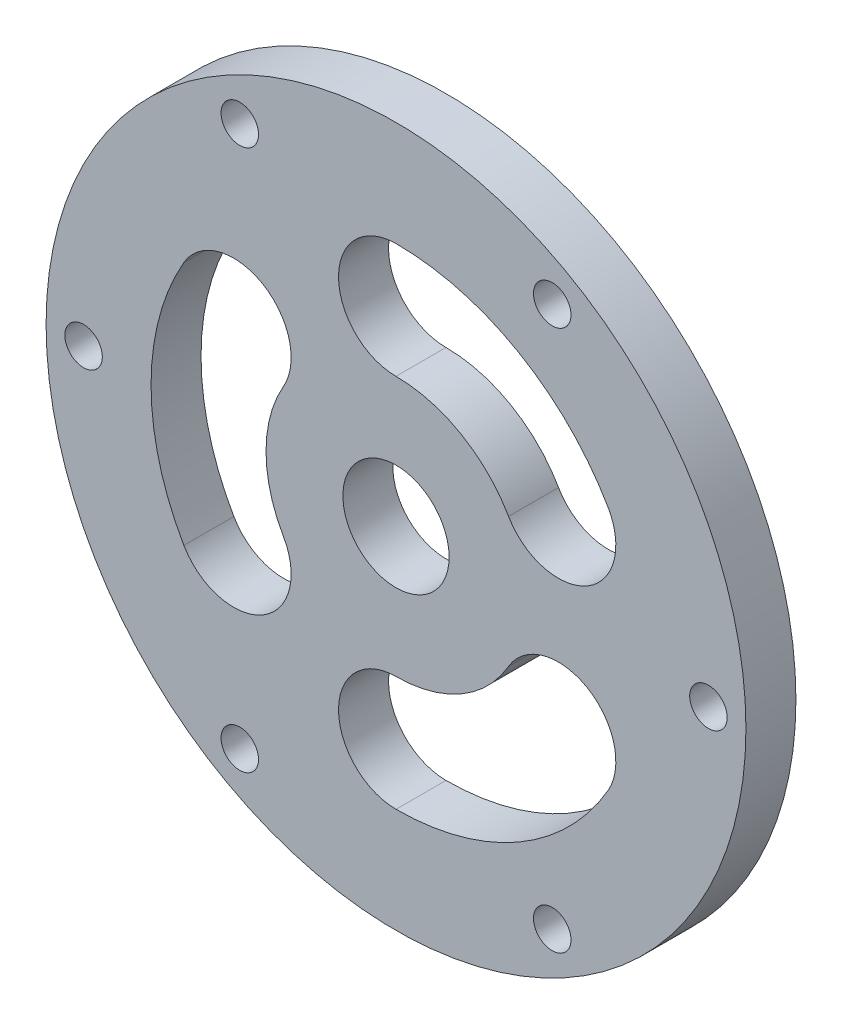
ISO-10303-21;
HEADER;
FILE_DESCRIPTION(('STEP AP214'),'2;1');
FILE_NAME('part.step','',(''),(''),'','','');
FILE_SCHEMA(('AUTOMOTIVE_DESIGN { 1 0 10303 214 1 1 1 1 }'));
ENDSEC;
DATA;
#1=APPLICATION_CONTEXT('core data for automotive mechanical design processes');
#2=APPLICATION_PROTOCOL_DEFINITION('international standard','automotive_design',2000,#1);
#3=PRODUCT_CONTEXT('',#1,'mechanical');
#4=PRODUCT('Part','Part','',(#3));
#5=PRODUCT_RELATED_PRODUCT_CATEGORY('part','',(#4));
#6=PRODUCT_DEFINITION_FORMATION('','',#4);
#7=PRODUCT_DEFINITION_CONTEXT('part definition',#1,'design');
#8=PRODUCT_DEFINITION('design','',#6,#7);
#9=PRODUCT_DEFINITION_SHAPE('','',#8);
#10=(LENGTH_UNIT() NAMED_UNIT(*) SI_UNIT(.MILLI.,.METRE.));
#11=(NAMED_UNIT(*) PLANE_ANGLE_UNIT() SI_UNIT($,.RADIAN.));
#12=(NAMED_UNIT(*) SI_UNIT($,.STERADIAN.) SOLID_ANGLE_UNIT());
#13=UNCERTAINTY_MEASURE_WITH_UNIT(LENGTH_MEASURE(1.E-05),#10,'distance_accuracy_value','');
#14=(GEOMETRIC_REPRESENTATION_CONTEXT(3) GLOBAL_UNCERTAINTY_ASSIGNED_CONTEXT((#13)) GLOBAL_UNIT_ASSIGNED_CONTEXT((#10,
#11,#12)) REPRESENTATION_CONTEXT('',''));
#15=CARTESIAN_POINT('',(0.,0.,0.));
#16=DIRECTION('',(0.,0.,1.));
#17=DIRECTION('',(1.,0.,0.));
#18=AXIS2_PLACEMENT_3D('',#15,#16,#17);
#19=CARTESIAN_POINT('',(0.,0.,4.));
#20=DIRECTION('',(0.,0.,1.));
#21=DIRECTION('',(1.,0.,0.));
#22=AXIS2_PLACEMENT_3D('',#19,#20,#21);
#23=PLANE('',#22);
#24=CARTESIAN_POINT('',(-24.9999999999986,-2.4721941194024E-12,4.));
#25=DIRECTION('',(0.,0.,1.));
#26=DIRECTION('',(1.,0.,0.));
#27=AXIS2_PLACEMENT_3D('',#24,#25,#26);
#28=CIRCLE('',#27,1.5000000000031);
#29=CARTESIAN_POINT('',(-23.4999999999955,-2.4721941194024E-12,4.));
#30=VERTEX_POINT('',#29);
#31=EDGE_CURVE('E270',#30,#30,#28,.T.);
#32=ORIENTED_EDGE('',*,*,#31,.F.);
#33=EDGE_LOOP('',(#32));
#34=FACE_BOUND('',#33,.T.);
#35=CARTESIAN_POINT('',(12.5000000000029,-21.650635094611,4.));
#36=DIRECTION('',(0.,0.,1.));
#37=DIRECTION('',(1.,0.,0.));
#38=AXIS2_PLACEMENT_3D('',#35,#36,#37);
#39=CIRCLE('',#38,1.5000000000031);
#40=CARTESIAN_POINT('',(14.000000000006,-21.650635094611,4.));
#41=VERTEX_POINT('',#40);
#42=EDGE_CURVE('E278',#41,#41,#39,.T.);
#43=ORIENTED_EDGE('',*,*,#42,.F.);
#44=EDGE_LOOP('',(#43));
#45=FACE_BOUND('',#44,.T.);
#46=CARTESIAN_POINT('',(0.,0.,4.));
#47=DIRECTION('',(0.,0.,-1.));
#48=DIRECTION('',(1.,0.,0.));
#49=AXIS2_PLACEMENT_3D('',#46,#47,#48);
#50=CIRCLE('',#49,10.4);
#51=CARTESIAN_POINT('',(2.43109524913691E-13,10.4,4.));
#52=VERTEX_POINT('',#51);
#53=CARTESIAN_POINT('',(9.00666419935822,5.19999999999989,4.));
#54=VERTEX_POINT('',#53);
#55=EDGE_CURVE('E130',#52,#54,#50,.T.);
#56=ORIENTED_EDGE('',*,*,#55,.F.);
#57=CARTESIAN_POINT('',(3.1485231088979E-13,15.,4.));
#58=DIRECTION('',(0.,0.,1.));
#59=DIRECTION('',(-1.,0.,0.));
#60=AXIS2_PLACEMENT_3D('',#57,#58,#59);
#61=CIRCLE('',#60,4.6);
#62=CARTESIAN_POINT('',(4.6252002505541E-13,19.6,4.));
#63=VERTEX_POINT('',#62);
#64=EDGE_CURVE('E122',#63,#52,#61,.T.);
#65=ORIENTED_EDGE('',*,*,#64,.F.);
#66=CARTESIAN_POINT('',(0.,0.,4.));
#67=DIRECTION('',(0.,0.,1.));
#68=DIRECTION('',(1.,0.,0.));
#69=AXIS2_PLACEMENT_3D('',#66,#67,#68);
#70=CIRCLE('',#69,19.6);
#71=CARTESIAN_POINT('',(16.9740979141751,9.79999999999979,4.));
#72=VERTEX_POINT('',#71);
#73=EDGE_CURVE('E145',#72,#63,#70,.T.);
#74=ORIENTED_EDGE('',*,*,#73,.F.);
#75=CARTESIAN_POINT('',(12.9903810567666,7.49999999999988,4.));
#76=DIRECTION('',(0.,0.,1.));
#77=DIRECTION('',(1.,0.,0.));
#78=AXIS2_PLACEMENT_3D('',#75,#76,#77);
#79=CIRCLE('',#78,4.6);
#80=EDGE_CURVE('E143',#54,#72,#79,.T.);
#81=ORIENTED_EDGE('',*,*,#80,.F.);
#82=EDGE_LOOP('',(#56,#65,#74,#81));
#83=FACE_BOUND('',#82,.T.);
#84=CARTESIAN_POINT('',(12.5,21.650635094611,4.));
#85=DIRECTION('',(0.,0.,1.));
#86=DIRECTION('',(1.,0.,0.));
#87=AXIS2_PLACEMENT_3D('',#84,#85,#86);
#88=CIRCLE('',#87,1.5000000000031);
#89=CARTESIAN_POINT('',(14.0000000000031,21.650635094611,4.));
#90=VERTEX_POINT('',#89);
#91=EDGE_CURVE('E161',#90,#90,#88,.T.);
#92=ORIENTED_EDGE('',*,*,#91,.F.);
#93=EDGE_LOOP('',(#92));
#94=FACE_BOUND('',#93,.T.);
#95=CARTESIAN_POINT('',(0.,0.,4.));
#96=DIRECTION('',(0.,0.,-1.));
#97=DIRECTION('',(1.,0.,0.));
#98=AXIS2_PLACEMENT_3D('',#95,#96,#97);
#99=CIRCLE('',#98,10.4);
#100=CARTESIAN_POINT('',(-9.00666419935829,-5.19999999999978,4.));
#101=VERTEX_POINT('',#100);
#102=CARTESIAN_POINT('',(-9.0066641993581,5.20000000000011,4.));
#103=VERTEX_POINT('',#102);
#104=EDGE_CURVE('E175',#101,#103,#99,.T.);
#105=ORIENTED_EDGE('',*,*,#104,.F.);
#106=CARTESIAN_POINT('',(-12.9903810567666,-7.4999999999999,4.));
#107=DIRECTION('',(0.,0.,1.));
#108=DIRECTION('',(-1.,0.,0.));
#109=AXIS2_PLACEMENT_3D('',#106,#107,#108);
#110=CIRCLE('',#109,4.6);
#111=CARTESIAN_POINT('',(-16.9740979141752,-9.7999999999996,4.));
#112=VERTEX_POINT('',#111);
#113=EDGE_CURVE('E173',#112,#101,#110,.T.);
#114=ORIENTED_EDGE('',*,*,#113,.F.);
#115=CARTESIAN_POINT('',(0.,0.,4.));
#116=DIRECTION('',(0.,0.,1.));
#117=DIRECTION('',(1.,0.,0.));
#118=AXIS2_PLACEMENT_3D('',#115,#116,#117);
#119=CIRCLE('',#118,19.6);
#120=CARTESIAN_POINT('',(-16.9740979141749,9.80000000000022,4.));
#121=VERTEX_POINT('',#120);
#122=EDGE_CURVE('E181',#121,#112,#119,.T.);
#123=ORIENTED_EDGE('',*,*,#122,.F.);
#124=CARTESIAN_POINT('',(-12.9903810567666,7.5,4.));
#125=DIRECTION('',(0.,0.,1.));
#126=DIRECTION('',(1.,0.,0.));
#127=AXIS2_PLACEMENT_3D('',#124,#125,#126);
#128=CIRCLE('',#127,4.6);
#129=EDGE_CURVE('E178',#103,#121,#128,.T.);
#130=ORIENTED_EDGE('',*,*,#129,.F.);
#131=EDGE_LOOP('',(#105,#114,#123,#130));
#132=FACE_BOUND('',#131,.T.);
#133=CARTESIAN_POINT('',(12.9903810567665,-7.50000000000015,4.));
#134=DIRECTION('',(0.,0.,1.));
#135=DIRECTION('',(-1.,0.,0.));
#136=AXIS2_PLACEMENT_3D('',#133,#134,#135);
#137=CIRCLE('',#136,4.6);
#138=CARTESIAN_POINT('',(16.9740979141748,-9.8000000000004,4.));
#139=VERTEX_POINT('',#138);
#140=CARTESIAN_POINT('',(9.00666419935803,-5.20000000000022,4.));
#141=VERTEX_POINT('',#140);
#142=EDGE_CURVE('E206',#139,#141,#137,.T.);
#143=ORIENTED_EDGE('',*,*,#142,.F.);
#144=CARTESIAN_POINT('',(0.,0.,4.));
#145=DIRECTION('',(0.,0.,1.));
#146=DIRECTION('',(1.,0.,0.));
#147=AXIS2_PLACEMENT_3D('',#144,#145,#146);
#148=CIRCLE('',#147,19.6);
#149=CARTESIAN_POINT('',(-2.45982250128646E-13,-19.6,4.));
#150=VERTEX_POINT('',#149);
#151=EDGE_CURVE('E204',#150,#139,#148,.T.);
#152=ORIENTED_EDGE('',*,*,#151,.F.);
#153=CARTESIAN_POINT('',(0.,-15.,4.));
#154=DIRECTION('',(0.,0.,1.));
#155=DIRECTION('',(1.,0.,0.));
#156=AXIS2_PLACEMENT_3D('',#153,#154,#155);
#157=CIRCLE('',#156,4.6);
#158=CARTESIAN_POINT('',(-1.40466282479889E-13,-10.4,4.));
#159=VERTEX_POINT('',#158);
#160=EDGE_CURVE('E212',#159,#150,#157,.T.);
#161=ORIENTED_EDGE('',*,*,#160,.F.);
#162=CARTESIAN_POINT('',(0.,0.,4.));
#163=DIRECTION('',(0.,0.,-1.));
#164=DIRECTION('',(1.,0.,0.));
#165=AXIS2_PLACEMENT_3D('',#162,#163,#164);
#166=CIRCLE('',#165,10.4);
#167=EDGE_CURVE('E209',#141,#159,#166,.T.);
#168=ORIENTED_EDGE('',*,*,#167,.F.);
#169=EDGE_LOOP('',(#143,#152,#161,#168));
#170=FACE_BOUND('',#169,.T.);
#171=CARTESIAN_POINT('',(0.,0.,4.));
#172=DIRECTION('',(0.,0.,1.));
#173=DIRECTION('',(1.,0.,0.));
#174=AXIS2_PLACEMENT_3D('',#171,#172,#173);
#175=CIRCLE('',#174,28.);
#176=CARTESIAN_POINT('',(28.,0.,4.));
#177=VERTEX_POINT('',#176);
#178=EDGE_CURVE('E11',#177,#177,#175,.T.);
#179=ORIENTED_EDGE('',*,*,#178,.T.);
#180=EDGE_LOOP('',(#179));
#181=FACE_BOUND('',#180,.T.);
#182=CARTESIAN_POINT('',(0.,0.,4.));
#183=DIRECTION('',(0.,0.,1.));
#184=DIRECTION('',(1.,0.,0.));
#185=AXIS2_PLACEMENT_3D('',#182,#183,#184);
#186=CIRCLE('',#185,4.25);
#187=CARTESIAN_POINT('',(4.25,0.,4.));
#188=VERTEX_POINT('',#187);
#189=EDGE_CURVE('E167',#188,#188,#186,.T.);
#190=ORIENTED_EDGE('',*,*,#189,.F.);
#191=EDGE_LOOP('',(#190));
#192=FACE_BOUND('',#191,.T.);
#193=CARTESIAN_POINT('',(25.0000000000014,8.27893104610886E-13,4.));
#194=DIRECTION('',(0.,0.,1.));
#195=DIRECTION('',(1.,0.,0.));
#196=AXIS2_PLACEMENT_3D('',#193,#194,#195);
#197=CIRCLE('',#196,1.5000000000031);
#198=CARTESIAN_POINT('',(26.5000000000045,8.27893104610886E-13,4.));
#199=VERTEX_POINT('',#198);
#200=EDGE_CURVE('E151',#199,#199,#197,.T.);
#201=ORIENTED_EDGE('',*,*,#200,.F.);
#202=EDGE_LOOP('',(#201));
#203=FACE_BOUND('',#202,.T.);
#204=CARTESIAN_POINT('',(-12.4999999999971,-21.6506350946126,4.));
#205=DIRECTION('',(0.,0.,1.));
#206=DIRECTION('',(1.,0.,0.));
#207=AXIS2_PLACEMENT_3D('',#204,#205,#206);
#208=CIRCLE('',#207,1.5000000000031);
#209=CARTESIAN_POINT('',(-10.999999999994,-21.6506350946126,4.));
#210=VERTEX_POINT('',#209);
#211=EDGE_CURVE('E274',#210,#210,#208,.T.);
#212=ORIENTED_EDGE('',*,*,#211,.F.);
#213=EDGE_LOOP('',(#212));
#214=FACE_BOUND('',#213,.T.);
#215=CARTESIAN_POINT('',(-12.5,21.6506350946093,4.));
#216=DIRECTION('',(0.,0.,1.));
#217=DIRECTION('',(1.,0.,0.));
#218=AXIS2_PLACEMENT_3D('',#215,#216,#217);
#219=CIRCLE('',#218,1.5000000000031);
#220=CARTESIAN_POINT('',(-10.9999999999969,21.6506350946093,4.));
#221=VERTEX_POINT('',#220);
#222=EDGE_CURVE('E265',#221,#221,#219,.T.);
#223=ORIENTED_EDGE('',*,*,#222,.F.);
#224=EDGE_LOOP('',(#223));
#225=FACE_BOUND('',#224,.T.);
#226=ADVANCED_FACE('F33',(#34,#45,#83,#94,#132,#170,#181,#192,#203,#214,#225),#23,.T.);
#227=CARTESIAN_POINT('',(0.,0.,0.));
#228=DIRECTION('',(0.,0.,1.));
#229=DIRECTION('',(1.,0.,0.));
#230=AXIS2_PLACEMENT_3D('',#227,#228,#229);
#231=PLANE('',#230);
#232=CARTESIAN_POINT('',(12.5,21.650635094611,0.));
#233=DIRECTION('',(0.,0.,1.));
#234=DIRECTION('',(1.,0.,0.));
#235=AXIS2_PLACEMENT_3D('',#232,#233,#234);
#236=CIRCLE('',#235,1.5000000000031);
#237=CARTESIAN_POINT('',(14.0000000000031,21.650635094611,0.));
#238=VERTEX_POINT('',#237);
#239=EDGE_CURVE('E138',#238,#238,#236,.T.);
#240=ORIENTED_EDGE('',*,*,#239,.T.);
#241=EDGE_LOOP('',(#240));
#242=FACE_BOUND('',#241,.T.);
#243=CARTESIAN_POINT('',(0.,0.,0.));
#244=DIRECTION('',(0.,0.,1.));
#245=DIRECTION('',(1.,0.,0.));
#246=AXIS2_PLACEMENT_3D('',#243,#244,#245);
#247=CIRCLE('',#246,4.25);
#248=CARTESIAN_POINT('',(4.25,0.,0.));
#249=VERTEX_POINT('',#248);
#250=EDGE_CURVE('E164',#249,#249,#247,.T.);
#251=ORIENTED_EDGE('',*,*,#250,.T.);
#252=EDGE_LOOP('',(#251));
#253=FACE_BOUND('',#252,.T.);
#254=CARTESIAN_POINT('',(-12.9903810567666,-7.4999999999999,0.));
#255=DIRECTION('',(0.,0.,1.));
#256=DIRECTION('',(-1.,0.,0.));
#257=AXIS2_PLACEMENT_3D('',#254,#255,#256);
#258=CIRCLE('',#257,4.6);
#259=CARTESIAN_POINT('',(-16.9740979141752,-9.7999999999996,0.));
#260=VERTEX_POINT('',#259);
#261=CARTESIAN_POINT('',(-9.00666419935829,-5.19999999999978,0.));
#262=VERTEX_POINT('',#261);
#263=EDGE_CURVE('E170',#260,#262,#258,.T.);
#264=ORIENTED_EDGE('',*,*,#263,.T.);
#265=CARTESIAN_POINT('',(0.,0.,0.));
#266=DIRECTION('',(0.,0.,-1.));
#267=DIRECTION('',(1.,0.,0.));
#268=AXIS2_PLACEMENT_3D('',#265,#266,#267);
#269=CIRCLE('',#268,10.4);
#270=CARTESIAN_POINT('',(-9.0066641993581,5.20000000000011,0.));
#271=VERTEX_POINT('',#270);
#272=EDGE_CURVE('E186',#262,#271,#269,.T.);
#273=ORIENTED_EDGE('',*,*,#272,.T.);
#274=CARTESIAN_POINT('',(-12.9903810567666,7.5,0.));
#275=DIRECTION('',(0.,0.,1.));
#276=DIRECTION('',(1.,0.,0.));
#277=AXIS2_PLACEMENT_3D('',#274,#275,#276);
#278=CIRCLE('',#277,4.6);
#279=CARTESIAN_POINT('',(-16.9740979141749,9.80000000000022,0.));
#280=VERTEX_POINT('',#279);
#281=EDGE_CURVE('E189',#271,#280,#278,.T.);
#282=ORIENTED_EDGE('',*,*,#281,.T.);
#283=CARTESIAN_POINT('',(0.,0.,0.));
#284=DIRECTION('',(0.,0.,1.));
#285=DIRECTION('',(1.,0.,0.));
#286=AXIS2_PLACEMENT_3D('',#283,#284,#285);
#287=CIRCLE('',#286,19.6);
#288=EDGE_CURVE('E176',#280,#260,#287,.T.);
#289=ORIENTED_EDGE('',*,*,#288,.T.);
#290=EDGE_LOOP('',(#264,#273,#282,#289));
#291=FACE_BOUND('',#290,.T.);
#292=CARTESIAN_POINT('',(0.,0.,0.));
#293=DIRECTION('',(0.,0.,1.));
#294=DIRECTION('',(1.,0.,0.));
#295=AXIS2_PLACEMENT_3D('',#292,#293,#294);
#296=CIRCLE('',#295,28.);
#297=CARTESIAN_POINT('',(28.,0.,0.));
#298=VERTEX_POINT('',#297);
#299=EDGE_CURVE('E37',#298,#298,#296,.T.);
#300=ORIENTED_EDGE('',*,*,#299,.F.);
#301=EDGE_LOOP('',(#300));
#302=FACE_BOUND('',#301,.T.);
#303=CARTESIAN_POINT('',(0.,0.,0.));
#304=DIRECTION('',(0.,0.,1.));
#305=DIRECTION('',(1.,0.,0.));
#306=AXIS2_PLACEMENT_3D('',#303,#304,#305);
#307=CIRCLE('',#306,19.6);
#308=CARTESIAN_POINT('',(-2.45982250128646E-13,-19.6,0.));
#309=VERTEX_POINT('',#308);
#310=CARTESIAN_POINT('',(16.9740979141748,-9.8000000000004,0.));
#311=VERTEX_POINT('',#310);
#312=EDGE_CURVE('E203',#309,#311,#307,.T.);
#313=ORIENTED_EDGE('',*,*,#312,.T.);
#314=CARTESIAN_POINT('',(12.9903810567665,-7.50000000000015,0.));
#315=DIRECTION('',(0.,0.,1.));
#316=DIRECTION('',(-1.,0.,0.));
#317=AXIS2_PLACEMENT_3D('',#314,#315,#316);
#318=CIRCLE('',#317,4.6);
#319=CARTESIAN_POINT('',(9.00666419935803,-5.20000000000022,0.));
#320=VERTEX_POINT('',#319);
#321=EDGE_CURVE('E217',#311,#320,#318,.T.);
#322=ORIENTED_EDGE('',*,*,#321,.T.);
#323=CARTESIAN_POINT('',(0.,0.,0.));
#324=DIRECTION('',(0.,0.,-1.));
#325=DIRECTION('',(1.,0.,0.));
#326=AXIS2_PLACEMENT_3D('',#323,#324,#325);
#327=CIRCLE('',#326,10.4);
#328=CARTESIAN_POINT('',(-1.40466282479889E-13,-10.4,0.));
#329=VERTEX_POINT('',#328);
#330=EDGE_CURVE('E220',#320,#329,#327,.T.);
#331=ORIENTED_EDGE('',*,*,#330,.T.);
#332=CARTESIAN_POINT('',(0.,-15.,0.));
#333=DIRECTION('',(0.,0.,1.));
#334=DIRECTION('',(1.,0.,0.));
#335=AXIS2_PLACEMENT_3D('',#332,#333,#334);
#336=CIRCLE('',#335,4.6);
#337=EDGE_CURVE('E207',#329,#309,#336,.T.);
#338=ORIENTED_EDGE('',*,*,#337,.T.);
#339=EDGE_LOOP('',(#313,#322,#331,#338));
#340=FACE_BOUND('',#339,.T.);
#341=CARTESIAN_POINT('',(3.1485231088979E-13,15.,0.));
#342=DIRECTION('',(0.,0.,1.));
#343=DIRECTION('',(-1.,0.,0.));
#344=AXIS2_PLACEMENT_3D('',#341,#342,#343);
#345=CIRCLE('',#344,4.6);
#346=CARTESIAN_POINT('',(4.6252002505541E-13,19.6,0.));
#347=VERTEX_POINT('',#346);
#348=CARTESIAN_POINT('',(2.43109524913691E-13,10.4,0.));
#349=VERTEX_POINT('',#348);
#350=EDGE_CURVE('E56',#347,#349,#345,.T.);
#351=ORIENTED_EDGE('',*,*,#350,.T.);
#352=CARTESIAN_POINT('',(0.,0.,0.));
#353=DIRECTION('',(0.,0.,-1.));
#354=DIRECTION('',(1.,0.,0.));
#355=AXIS2_PLACEMENT_3D('',#352,#353,#354);
#356=CIRCLE('',#355,10.4);
#357=CARTESIAN_POINT('',(9.00666419935822,5.19999999999989,0.));
#358=VERTEX_POINT('',#357);
#359=EDGE_CURVE('E137',#349,#358,#356,.T.);
#360=ORIENTED_EDGE('',*,*,#359,.T.);
#361=CARTESIAN_POINT('',(12.9903810567666,7.49999999999988,0.));
#362=DIRECTION('',(0.,0.,1.));
#363=DIRECTION('',(1.,0.,0.));
#364=AXIS2_PLACEMENT_3D('',#361,#362,#363);
#365=CIRCLE('',#364,4.6);
#366=CARTESIAN_POINT('',(16.9740979141751,9.79999999999979,0.));
#367=VERTEX_POINT('',#366);
#368=EDGE_CURVE('E153',#358,#367,#365,.T.);
#369=ORIENTED_EDGE('',*,*,#368,.T.);
#370=CARTESIAN_POINT('',(0.,0.,0.));
#371=DIRECTION('',(0.,0.,1.));
#372=DIRECTION('',(1.,0.,0.));
#373=AXIS2_PLACEMENT_3D('',#370,#371,#372);
#374=CIRCLE('',#373,19.6);
#375=EDGE_CURVE('E131',#367,#347,#374,.T.);
#376=ORIENTED_EDGE('',*,*,#375,.T.);
#377=EDGE_LOOP('',(#351,#360,#369,#376));
#378=FACE_BOUND('',#377,.T.);
#379=CARTESIAN_POINT('',(25.0000000000014,8.27893104610886E-13,0.));
#380=DIRECTION('',(0.,0.,1.));
#381=DIRECTION('',(1.,0.,0.));
#382=AXIS2_PLACEMENT_3D('',#379,#380,#381);
#383=CIRCLE('',#382,1.5000000000031);
#384=CARTESIAN_POINT('',(26.5000000000045,8.27893104610886E-13,0.));
#385=VERTEX_POINT('',#384);
#386=EDGE_CURVE('E248',#385,#385,#383,.T.);
#387=ORIENTED_EDGE('',*,*,#386,.T.);
#388=EDGE_LOOP('',(#387));
#389=FACE_BOUND('',#388,.T.);
#390=CARTESIAN_POINT('',(12.5000000000029,-21.650635094611,0.));
#391=DIRECTION('',(0.,0.,1.));
#392=DIRECTION('',(1.,0.,0.));
#393=AXIS2_PLACEMENT_3D('',#390,#391,#392);
#394=CIRCLE('',#393,1.5000000000031);
#395=CARTESIAN_POINT('',(14.000000000006,-21.650635094611,0.));
#396=VERTEX_POINT('',#395);
#397=EDGE_CURVE('E252',#396,#396,#394,.T.);
#398=ORIENTED_EDGE('',*,*,#397,.T.);
#399=EDGE_LOOP('',(#398));
#400=FACE_BOUND('',#399,.T.);
#401=CARTESIAN_POINT('',(-12.4999999999971,-21.6506350946126,0.));
#402=DIRECTION('',(0.,0.,1.));
#403=DIRECTION('',(1.,0.,0.));
#404=AXIS2_PLACEMENT_3D('',#401,#402,#403);
#405=CIRCLE('',#404,1.5000000000031);
#406=CARTESIAN_POINT('',(-10.999999999994,-21.6506350946126,0.));
#407=VERTEX_POINT('',#406);
#408=EDGE_CURVE('E256',#407,#407,#405,.T.);
#409=ORIENTED_EDGE('',*,*,#408,.T.);
#410=EDGE_LOOP('',(#409));
#411=FACE_BOUND('',#410,.T.);
#412=CARTESIAN_POINT('',(-24.9999999999986,-2.4721941194024E-12,0.));
#413=DIRECTION('',(0.,0.,1.));
#414=DIRECTION('',(1.,0.,0.));
#415=AXIS2_PLACEMENT_3D('',#412,#413,#414);
#416=CIRCLE('',#415,1.5000000000031);
#417=CARTESIAN_POINT('',(-23.4999999999955,-2.4721941194024E-12,0.));
#418=VERTEX_POINT('',#417);
#419=EDGE_CURVE('E260',#418,#418,#416,.T.);
#420=ORIENTED_EDGE('',*,*,#419,.T.);
#421=EDGE_LOOP('',(#420));
#422=FACE_BOUND('',#421,.T.);
#423=CARTESIAN_POINT('',(-12.5,21.6506350946093,0.));
#424=DIRECTION('',(0.,0.,1.));
#425=DIRECTION('',(1.,0.,0.));
#426=AXIS2_PLACEMENT_3D('',#423,#424,#425);
#427=CIRCLE('',#426,1.5000000000031);
#428=CARTESIAN_POINT('',(-10.9999999999969,21.6506350946093,0.));
#429=VERTEX_POINT('',#428);
#430=EDGE_CURVE('E263',#429,#429,#427,.T.);
#431=ORIENTED_EDGE('',*,*,#430,.T.);
#432=EDGE_LOOP('',(#431));
#433=FACE_BOUND('',#432,.T.);
#434=ADVANCED_FACE('F239',(#242,#253,#291,#302,#340,#378,#389,#400,#411,#422,#433),#231,.F.);
#435=CARTESIAN_POINT('',(0.,0.,4.));
#436=DIRECTION('',(0.,0.,-1.));
#437=DIRECTION('',(-1.,0.,0.));
#438=AXIS2_PLACEMENT_3D('',#435,#436,#437);
#439=CYLINDRICAL_SURFACE('',#438,28.);
#440=ORIENTED_EDGE('',*,*,#178,.F.);
#441=EDGE_LOOP('',(#440));
#442=FACE_BOUND('',#441,.T.);
#443=ORIENTED_EDGE('',*,*,#299,.T.);
#444=EDGE_LOOP('',(#443));
#445=FACE_BOUND('',#444,.T.);
#446=ADVANCED_FACE('F35',(#442,#445),#439,.T.);
#447=CARTESIAN_POINT('',(0.,0.,4.));
#448=DIRECTION('',(0.,0.,-1.));
#449=DIRECTION('',(-1.,0.,0.));
#450=AXIS2_PLACEMENT_3D('',#447,#448,#449);
#451=CYLINDRICAL_SURFACE('',#450,19.6);
#452=ORIENTED_EDGE('',*,*,#312,.F.);
#453=DIRECTION('',(0.,0.,-1.));
#454=VECTOR('',#453,1.);
#455=CARTESIAN_POINT('',(-2.45982250128646E-13,-19.6,4.));
#456=LINE('',#455,#454);
#457=EDGE_CURVE('E214',#150,#309,#456,.T.);
#458=ORIENTED_EDGE('',*,*,#457,.F.);
#459=ORIENTED_EDGE('',*,*,#151,.T.);
#460=DIRECTION('',(0.,0.,-1.));
#461=VECTOR('',#460,1.);
#462=CARTESIAN_POINT('',(16.9740979141748,-9.8000000000004,4.));
#463=LINE('',#462,#461);
#464=EDGE_CURVE('E231',#139,#311,#463,.T.);
#465=ORIENTED_EDGE('',*,*,#464,.T.);
#466=EDGE_LOOP('',(#452,#458,#459,#465));
#467=FACE_BOUND('',#466,.T.);
#468=ADVANCED_FACE('F362',(#467),#451,.F.);
#469=CARTESIAN_POINT('',(12.9903810567665,-7.50000000000015,4.));
#470=DIRECTION('',(0.,0.,-1.));
#471=DIRECTION('',(-1.,0.,0.));
#472=AXIS2_PLACEMENT_3D('',#469,#470,#471);
#473=CYLINDRICAL_SURFACE('',#472,4.6);
#474=ORIENTED_EDGE('',*,*,#321,.F.);
#475=ORIENTED_EDGE('',*,*,#464,.F.);
#476=ORIENTED_EDGE('',*,*,#142,.T.);
#477=DIRECTION('',(0.,0.,-1.));
#478=VECTOR('',#477,1.);
#479=CARTESIAN_POINT('',(9.00666419935803,-5.20000000000022,4.));
#480=LINE('',#479,#478);
#481=EDGE_CURVE('E229',#141,#320,#480,.T.);
#482=ORIENTED_EDGE('',*,*,#481,.T.);
#483=EDGE_LOOP('',(#474,#475,#476,#482));
#484=FACE_BOUND('',#483,.T.);
#485=ADVANCED_FACE('F358',(#484),#473,.F.);
#486=CARTESIAN_POINT('',(0.,0.,4.));
#487=DIRECTION('',(0.,0.,-1.));
#488=DIRECTION('',(-1.,0.,0.));
#489=AXIS2_PLACEMENT_3D('',#486,#487,#488);
#490=CYLINDRICAL_SURFACE('',#489,10.4);
#491=ORIENTED_EDGE('',*,*,#330,.F.);
#492=ORIENTED_EDGE('',*,*,#481,.F.);
#493=ORIENTED_EDGE('',*,*,#167,.T.);
#494=DIRECTION('',(0.,0.,-1.));
#495=VECTOR('',#494,1.);
#496=CARTESIAN_POINT('',(-1.40466282479889E-13,-10.4,4.));
#497=LINE('',#496,#495);
#498=EDGE_CURVE('E227',#159,#329,#497,.T.);
#499=ORIENTED_EDGE('',*,*,#498,.T.);
#500=EDGE_LOOP('',(#491,#492,#493,#499));
#501=FACE_BOUND('',#500,.T.);
#502=ADVANCED_FACE('F354',(#501),#490,.T.);
#503=CARTESIAN_POINT('',(0.,-15.,4.));
#504=DIRECTION('',(0.,0.,-1.));
#505=DIRECTION('',(-1.,0.,0.));
#506=AXIS2_PLACEMENT_3D('',#503,#504,#505);
#507=CYLINDRICAL_SURFACE('',#506,4.6);
#508=ORIENTED_EDGE('',*,*,#337,.F.);
#509=ORIENTED_EDGE('',*,*,#498,.F.);
#510=ORIENTED_EDGE('',*,*,#160,.T.);
#511=ORIENTED_EDGE('',*,*,#457,.T.);
#512=EDGE_LOOP('',(#508,#509,#510,#511));
#513=FACE_BOUND('',#512,.T.);
#514=ADVANCED_FACE('F350',(#513),#507,.F.);
#515=CARTESIAN_POINT('',(-12.9903810567666,-7.4999999999999,4.));
#516=DIRECTION('',(0.,0.,-1.));
#517=DIRECTION('',(-1.,0.,0.));
#518=AXIS2_PLACEMENT_3D('',#515,#516,#517);
#519=CYLINDRICAL_SURFACE('',#518,4.6);
#520=ORIENTED_EDGE('',*,*,#263,.F.);
#521=DIRECTION('',(0.,0.,-1.));
#522=VECTOR('',#521,1.);
#523=CARTESIAN_POINT('',(-16.9740979141752,-9.7999999999996,4.));
#524=LINE('',#523,#522);
#525=EDGE_CURVE('E183',#112,#260,#524,.T.);
#526=ORIENTED_EDGE('',*,*,#525,.F.);
#527=ORIENTED_EDGE('',*,*,#113,.T.);
#528=DIRECTION('',(0.,0.,-1.));
#529=VECTOR('',#528,1.);
#530=CARTESIAN_POINT('',(-9.00666419935829,-5.19999999999978,4.));
#531=LINE('',#530,#529);
#532=EDGE_CURVE('E200',#101,#262,#531,.T.);
#533=ORIENTED_EDGE('',*,*,#532,.T.);
#534=EDGE_LOOP('',(#520,#526,#527,#533));
#535=FACE_BOUND('',#534,.T.);
#536=ADVANCED_FACE('F346',(#535),#519,.F.);
#537=CARTESIAN_POINT('',(0.,0.,4.));
#538=DIRECTION('',(0.,0.,-1.));
#539=DIRECTION('',(-1.,0.,0.));
#540=AXIS2_PLACEMENT_3D('',#537,#538,#539);
#541=CYLINDRICAL_SURFACE('',#540,10.4);
#542=ORIENTED_EDGE('',*,*,#272,.F.);
#543=ORIENTED_EDGE('',*,*,#532,.F.);
#544=ORIENTED_EDGE('',*,*,#104,.T.);
#545=DIRECTION('',(0.,0.,-1.));
#546=VECTOR('',#545,1.);
#547=CARTESIAN_POINT('',(-9.0066641993581,5.20000000000011,4.));
#548=LINE('',#547,#546);
#549=EDGE_CURVE('E198',#103,#271,#548,.T.);
#550=ORIENTED_EDGE('',*,*,#549,.T.);
#551=EDGE_LOOP('',(#542,#543,#544,#550));
#552=FACE_BOUND('',#551,.T.);
#553=ADVANCED_FACE('F342',(#552),#541,.T.);
#554=CARTESIAN_POINT('',(-12.9903810567666,7.5,4.));
#555=DIRECTION('',(0.,0.,-1.));
#556=DIRECTION('',(-1.,0.,0.));
#557=AXIS2_PLACEMENT_3D('',#554,#555,#556);
#558=CYLINDRICAL_SURFACE('',#557,4.6);
#559=ORIENTED_EDGE('',*,*,#281,.F.);
#560=ORIENTED_EDGE('',*,*,#549,.F.);
#561=ORIENTED_EDGE('',*,*,#129,.T.);
#562=DIRECTION('',(0.,0.,-1.));
#563=VECTOR('',#562,1.);
#564=CARTESIAN_POINT('',(-16.9740979141749,9.80000000000022,4.));
#565=LINE('',#564,#563);
#566=EDGE_CURVE('E196',#121,#280,#565,.T.);
#567=ORIENTED_EDGE('',*,*,#566,.T.);
#568=EDGE_LOOP('',(#559,#560,#561,#567));
#569=FACE_BOUND('',#568,.T.);
#570=ADVANCED_FACE('F338',(#569),#558,.F.);
#571=CARTESIAN_POINT('',(0.,0.,4.));
#572=DIRECTION('',(0.,0.,-1.));
#573=DIRECTION('',(-1.,0.,0.));
#574=AXIS2_PLACEMENT_3D('',#571,#572,#573);
#575=CYLINDRICAL_SURFACE('',#574,19.6);
#576=ORIENTED_EDGE('',*,*,#288,.F.);
#577=ORIENTED_EDGE('',*,*,#566,.F.);
#578=ORIENTED_EDGE('',*,*,#122,.T.);
#579=ORIENTED_EDGE('',*,*,#525,.T.);
#580=EDGE_LOOP('',(#576,#577,#578,#579));
#581=FACE_BOUND('',#580,.T.);
#582=ADVANCED_FACE('F334',(#581),#575,.F.);
#583=CARTESIAN_POINT('',(0.,0.,4.));
#584=DIRECTION('',(0.,0.,-1.));
#585=DIRECTION('',(-1.,0.,0.));
#586=AXIS2_PLACEMENT_3D('',#583,#584,#585);
#587=CYLINDRICAL_SURFACE('',#586,4.25);
#588=ORIENTED_EDGE('',*,*,#189,.T.);
#589=EDGE_LOOP('',(#588));
#590=FACE_BOUND('',#589,.T.);
#591=ORIENTED_EDGE('',*,*,#250,.F.);
#592=EDGE_LOOP('',(#591));
#593=FACE_BOUND('',#592,.T.);
#594=ADVANCED_FACE('F330',(#590,#593),#587,.F.);
#595=CARTESIAN_POINT('',(12.5,21.650635094611,4.));
#596=DIRECTION('',(0.,0.,-1.));
#597=DIRECTION('',(-1.,0.,0.));
#598=AXIS2_PLACEMENT_3D('',#595,#596,#597);
#599=CYLINDRICAL_SURFACE('',#598,1.5000000000031);
#600=ORIENTED_EDGE('',*,*,#91,.T.);
#601=EDGE_LOOP('',(#600));
#602=FACE_BOUND('',#601,.T.);
#603=ORIENTED_EDGE('',*,*,#239,.F.);
#604=EDGE_LOOP('',(#603));
#605=FACE_BOUND('',#604,.T.);
#606=ADVANCED_FACE('F327',(#602,#605),#599,.F.);
#607=CARTESIAN_POINT('',(3.1485231088979E-13,15.,4.));
#608=DIRECTION('',(0.,0.,-1.));
#609=DIRECTION('',(-1.,0.,0.));
#610=AXIS2_PLACEMENT_3D('',#607,#608,#609);
#611=CYLINDRICAL_SURFACE('',#610,4.6);
#612=ORIENTED_EDGE('',*,*,#350,.F.);
#613=DIRECTION('',(0.,0.,-1.));
#614=VECTOR('',#613,1.);
#615=CARTESIAN_POINT('',(4.6252002505541E-13,19.6,4.));
#616=LINE('',#615,#614);
#617=EDGE_CURVE('E126',#63,#347,#616,.T.);
#618=ORIENTED_EDGE('',*,*,#617,.F.);
#619=ORIENTED_EDGE('',*,*,#64,.T.);
#620=DIRECTION('',(0.,0.,-1.));
#621=VECTOR('',#620,1.);
#622=CARTESIAN_POINT('',(2.43109524913691E-13,10.4,4.));
#623=LINE('',#622,#621);
#624=EDGE_CURVE('E125',#52,#349,#623,.T.);
#625=ORIENTED_EDGE('',*,*,#624,.T.);
#626=EDGE_LOOP('',(#612,#618,#619,#625));
#627=FACE_BOUND('',#626,.T.);
#628=ADVANCED_FACE('F124',(#627),#611,.F.);
#629=CARTESIAN_POINT('',(0.,0.,4.));
#630=DIRECTION('',(0.,0.,-1.));
#631=DIRECTION('',(-1.,0.,0.));
#632=AXIS2_PLACEMENT_3D('',#629,#630,#631);
#633=CYLINDRICAL_SURFACE('',#632,10.4);
#634=ORIENTED_EDGE('',*,*,#359,.F.);
#635=ORIENTED_EDGE('',*,*,#624,.F.);
#636=ORIENTED_EDGE('',*,*,#55,.T.);
#637=DIRECTION('',(0.,0.,-1.));
#638=VECTOR('',#637,1.);
#639=CARTESIAN_POINT('',(9.00666419935822,5.19999999999989,4.));
#640=LINE('',#639,#638);
#641=EDGE_CURVE('E139',#54,#358,#640,.T.);
#642=ORIENTED_EDGE('',*,*,#641,.T.);
#643=EDGE_LOOP('',(#634,#635,#636,#642));
#644=FACE_BOUND('',#643,.T.);
#645=ADVANCED_FACE('F134',(#644),#633,.T.);
#646=CARTESIAN_POINT('',(12.9903810567666,7.49999999999988,4.));
#647=DIRECTION('',(0.,0.,-1.));
#648=DIRECTION('',(-1.,0.,0.));
#649=AXIS2_PLACEMENT_3D('',#646,#647,#648);
#650=CYLINDRICAL_SURFACE('',#649,4.6);
#651=ORIENTED_EDGE('',*,*,#368,.F.);
#652=ORIENTED_EDGE('',*,*,#641,.F.);
#653=ORIENTED_EDGE('',*,*,#80,.T.);
#654=DIRECTION('',(0.,0.,-1.));
#655=VECTOR('',#654,1.);
#656=CARTESIAN_POINT('',(16.9740979141751,9.79999999999979,4.));
#657=LINE('',#656,#655);
#658=EDGE_CURVE('E48',#72,#367,#657,.T.);
#659=ORIENTED_EDGE('',*,*,#658,.T.);
#660=EDGE_LOOP('',(#651,#652,#653,#659));
#661=FACE_BOUND('',#660,.T.);
#662=ADVANCED_FACE('F319',(#661),#650,.F.);
#663=CARTESIAN_POINT('',(0.,0.,4.));
#664=DIRECTION('',(0.,0.,-1.));
#665=DIRECTION('',(-1.,0.,0.));
#666=AXIS2_PLACEMENT_3D('',#663,#664,#665);
#667=CYLINDRICAL_SURFACE('',#666,19.6);
#668=ORIENTED_EDGE('',*,*,#375,.F.);
#669=ORIENTED_EDGE('',*,*,#658,.F.);
#670=ORIENTED_EDGE('',*,*,#73,.T.);
#671=ORIENTED_EDGE('',*,*,#617,.T.);
#672=EDGE_LOOP('',(#668,#669,#670,#671));
#673=FACE_BOUND('',#672,.T.);
#674=ADVANCED_FACE('F316',(#673),#667,.F.);
#675=CARTESIAN_POINT('',(25.0000000000014,8.27893104610886E-13,4.));
#676=DIRECTION('',(0.,0.,-1.));
#677=DIRECTION('',(-1.,0.,0.));
#678=AXIS2_PLACEMENT_3D('',#675,#676,#677);
#679=CYLINDRICAL_SURFACE('',#678,1.5000000000031);
#680=ORIENTED_EDGE('',*,*,#200,.T.);
#681=EDGE_LOOP('',(#680));
#682=FACE_BOUND('',#681,.T.);
#683=ORIENTED_EDGE('',*,*,#386,.F.);
#684=EDGE_LOOP('',(#683));
#685=FACE_BOUND('',#684,.T.);
#686=ADVANCED_FACE('F285',(#682,#685),#679,.F.);
#687=CARTESIAN_POINT('',(12.5000000000029,-21.650635094611,4.));
#688=DIRECTION('',(0.,0.,-1.));
#689=DIRECTION('',(-1.,0.,0.));
#690=AXIS2_PLACEMENT_3D('',#687,#688,#689);
#691=CYLINDRICAL_SURFACE('',#690,1.5000000000031);
#692=ORIENTED_EDGE('',*,*,#42,.T.);
#693=EDGE_LOOP('',(#692));
#694=FACE_BOUND('',#693,.T.);
#695=ORIENTED_EDGE('',*,*,#397,.F.);
#696=EDGE_LOOP('',(#695));
#697=FACE_BOUND('',#696,.T.);
#698=ADVANCED_FACE('F309',(#694,#697),#691,.F.);
#699=CARTESIAN_POINT('',(-12.4999999999971,-21.6506350946126,4.));
#700=DIRECTION('',(0.,0.,-1.));
#701=DIRECTION('',(-1.,0.,0.));
#702=AXIS2_PLACEMENT_3D('',#699,#700,#701);
#703=CYLINDRICAL_SURFACE('',#702,1.5000000000031);
#704=ORIENTED_EDGE('',*,*,#211,.T.);
#705=EDGE_LOOP('',(#704));
#706=FACE_BOUND('',#705,.T.);
#707=ORIENTED_EDGE('',*,*,#408,.F.);
#708=EDGE_LOOP('',(#707));
#709=FACE_BOUND('',#708,.T.);
#710=ADVANCED_FACE('F303',(#706,#709),#703,.F.);
#711=CARTESIAN_POINT('',(-24.9999999999986,-2.4721941194024E-12,4.));
#712=DIRECTION('',(0.,0.,-1.));
#713=DIRECTION('',(-1.,0.,0.));
#714=AXIS2_PLACEMENT_3D('',#711,#712,#713);
#715=CYLINDRICAL_SURFACE('',#714,1.5000000000031);
#716=ORIENTED_EDGE('',*,*,#31,.T.);
#717=EDGE_LOOP('',(#716));
#718=FACE_BOUND('',#717,.T.);
#719=ORIENTED_EDGE('',*,*,#419,.F.);
#720=EDGE_LOOP('',(#719));
#721=FACE_BOUND('',#720,.T.);
#722=ADVANCED_FACE('F298',(#718,#721),#715,.F.);
#723=CARTESIAN_POINT('',(-12.5,21.6506350946093,4.));
#724=DIRECTION('',(0.,0.,-1.));
#725=DIRECTION('',(-1.,0.,0.));
#726=AXIS2_PLACEMENT_3D('',#723,#724,#725);
#727=CYLINDRICAL_SURFACE('',#726,1.5000000000031);
#728=ORIENTED_EDGE('',*,*,#222,.T.);
#729=EDGE_LOOP('',(#728));
#730=FACE_BOUND('',#729,.T.);
#731=ORIENTED_EDGE('',*,*,#430,.F.);
#732=EDGE_LOOP('',(#731));
#733=FACE_BOUND('',#732,.T.);
#734=ADVANCED_FACE('F296',(#730,#733),#727,.F.);
#735=CLOSED_SHELL('',(#226,#434,#446,#468,#485,#502,#514,#536,#553,#570,#582,#594,#606,#628,
#645,#662,#674,#686,#698,#710,#722,#734));
#736=MANIFOLD_SOLID_BREP('B2',#735);
#737=ADVANCED_BREP_SHAPE_REPRESENTATION('',(#18,#736),#14);
#738=SHAPE_DEFINITION_REPRESENTATION(#9,#737);
ENDSEC;
END-ISO-10303-21;
